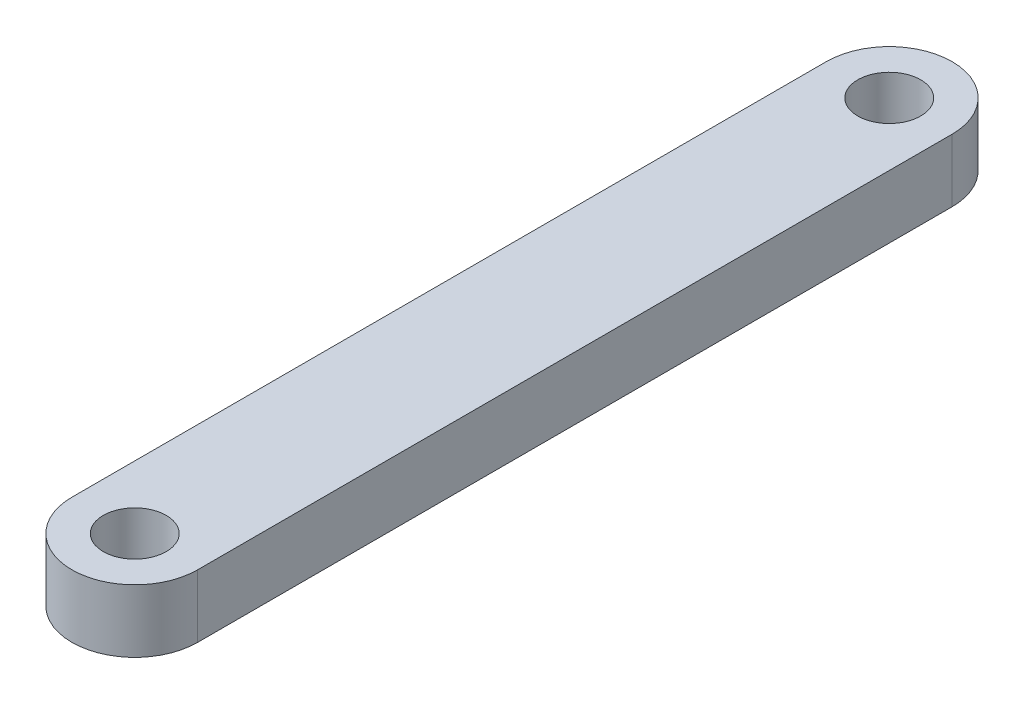
ISO-10303-21;
HEADER;
FILE_DESCRIPTION(('STEP AP214'),'2;1');
FILE_NAME('part.step','',(''),(''),'','','');
FILE_SCHEMA(('AUTOMOTIVE_DESIGN { 1 0 10303 214 1 1 1 1 }'));
ENDSEC;
DATA;
#1=APPLICATION_CONTEXT('core data for automotive mechanical design processes');
#2=APPLICATION_PROTOCOL_DEFINITION('international standard','automotive_design',2000,#1);
#3=PRODUCT_CONTEXT('',#1,'mechanical');
#4=PRODUCT('Part','Part','',(#3));
#5=PRODUCT_RELATED_PRODUCT_CATEGORY('part','',(#4));
#6=PRODUCT_DEFINITION_FORMATION('','',#4);
#7=PRODUCT_DEFINITION_CONTEXT('part definition',#1,'design');
#8=PRODUCT_DEFINITION('design','',#6,#7);
#9=PRODUCT_DEFINITION_SHAPE('','',#8);
#10=(LENGTH_UNIT() NAMED_UNIT(*) SI_UNIT(.MILLI.,.METRE.));
#11=(NAMED_UNIT(*) PLANE_ANGLE_UNIT() SI_UNIT($,.RADIAN.));
#12=(NAMED_UNIT(*) SI_UNIT($,.STERADIAN.) SOLID_ANGLE_UNIT());
#13=UNCERTAINTY_MEASURE_WITH_UNIT(LENGTH_MEASURE(1.E-05),#10,'distance_accuracy_value','');
#14=(GEOMETRIC_REPRESENTATION_CONTEXT(3) GLOBAL_UNCERTAINTY_ASSIGNED_CONTEXT((#13)) GLOBAL_UNIT_ASSIGNED_CONTEXT((#10,
#11,#12)) REPRESENTATION_CONTEXT('',''));
#15=CARTESIAN_POINT('',(0.,0.,0.));
#16=DIRECTION('',(0.,0.,1.));
#17=DIRECTION('',(1.,0.,0.));
#18=AXIS2_PLACEMENT_3D('',#15,#16,#17);
#19=CARTESIAN_POINT('',(0.,3.,36.));
#20=DIRECTION('',(0.,-1.,0.));
#21=DIRECTION('',(0.,0.,-1.));
#22=AXIS2_PLACEMENT_3D('',#19,#20,#21);
#23=PLANE('',#22);
#24=CARTESIAN_POINT('',(0.,3.,36.));
#25=DIRECTION('',(0.,1.,0.));
#26=DIRECTION('',(0.,0.,-1.));
#27=AXIS2_PLACEMENT_3D('',#24,#25,#26);
#28=CIRCLE('',#27,3.);
#29=CARTESIAN_POINT('',(-3.,3.,36.));
#30=VERTEX_POINT('',#29);
#31=CARTESIAN_POINT('',(3.,3.,36.));
#32=VERTEX_POINT('',#31);
#33=EDGE_CURVE('E85',#30,#32,#28,.T.);
#34=ORIENTED_EDGE('',*,*,#33,.T.);
#35=DIRECTION('',(0.,0.,-1.));
#36=VECTOR('',#35,1.);
#37=CARTESIAN_POINT('',(3.,3.,0.));
#38=LINE('',#37,#36);
#39=CARTESIAN_POINT('',(3.,3.,0.));
#40=VERTEX_POINT('',#39);
#41=EDGE_CURVE('E80',#32,#40,#38,.T.);
#42=ORIENTED_EDGE('',*,*,#41,.T.);
#43=CARTESIAN_POINT('',(0.,3.,0.));
#44=DIRECTION('',(0.,1.,0.));
#45=DIRECTION('',(0.,0.,1.));
#46=AXIS2_PLACEMENT_3D('',#43,#44,#45);
#47=CIRCLE('',#46,3.);
#48=CARTESIAN_POINT('',(-3.,3.,0.));
#49=VERTEX_POINT('',#48);
#50=EDGE_CURVE('E83',#40,#49,#47,.T.);
#51=ORIENTED_EDGE('',*,*,#50,.T.);
#52=DIRECTION('',(0.,0.,1.));
#53=VECTOR('',#52,1.);
#54=CARTESIAN_POINT('',(-3.,3.,0.));
#55=LINE('',#54,#53);
#56=EDGE_CURVE('E50',#49,#30,#55,.T.);
#57=ORIENTED_EDGE('',*,*,#56,.T.);
#58=EDGE_LOOP('',(#34,#42,#51,#57));
#59=FACE_BOUND('',#58,.T.);
#60=CARTESIAN_POINT('',(0.,3.,0.));
#61=DIRECTION('',(0.,1.,0.));
#62=DIRECTION('',(0.,0.,1.));
#63=AXIS2_PLACEMENT_3D('',#60,#61,#62);
#64=CIRCLE('',#63,1.5);
#65=CARTESIAN_POINT('',(0.,3.,1.5));
#66=VERTEX_POINT('',#65);
#67=EDGE_CURVE('E100',#66,#66,#64,.T.);
#68=ORIENTED_EDGE('',*,*,#67,.F.);
#69=EDGE_LOOP('',(#68));
#70=FACE_BOUND('',#69,.T.);
#71=CARTESIAN_POINT('',(0.,3.,36.));
#72=DIRECTION('',(0.,1.,0.));
#73=DIRECTION('',(0.,0.,-1.));
#74=AXIS2_PLACEMENT_3D('',#71,#72,#73);
#75=CIRCLE('',#74,1.5);
#76=CARTESIAN_POINT('',(0.,3.,34.5));
#77=VERTEX_POINT('',#76);
#78=EDGE_CURVE('E115',#77,#77,#75,.T.);
#79=ORIENTED_EDGE('',*,*,#78,.F.);
#80=EDGE_LOOP('',(#79));
#81=FACE_BOUND('',#80,.T.);
#82=ADVANCED_FACE('F33',(#59,#70,#81),#23,.F.);
#83=CARTESIAN_POINT('',(0.,0.,36.));
#84=DIRECTION('',(0.,-1.,0.));
#85=DIRECTION('',(0.,0.,-1.));
#86=AXIS2_PLACEMENT_3D('',#83,#84,#85);
#87=PLANE('',#86);
#88=CARTESIAN_POINT('',(0.,0.,0.));
#89=DIRECTION('',(0.,1.,0.));
#90=DIRECTION('',(0.,0.,1.));
#91=AXIS2_PLACEMENT_3D('',#88,#89,#90);
#92=CIRCLE('',#91,1.5);
#93=CARTESIAN_POINT('',(0.,0.,1.5));
#94=VERTEX_POINT('',#93);
#95=EDGE_CURVE('E112',#94,#94,#92,.T.);
#96=ORIENTED_EDGE('',*,*,#95,.T.);
#97=EDGE_LOOP('',(#96));
#98=FACE_BOUND('',#97,.T.);
#99=CARTESIAN_POINT('',(0.,0.,36.));
#100=DIRECTION('',(0.,1.,0.));
#101=DIRECTION('',(0.,0.,-1.));
#102=AXIS2_PLACEMENT_3D('',#99,#100,#101);
#103=CIRCLE('',#102,3.);
#104=CARTESIAN_POINT('',(-3.,0.,36.));
#105=VERTEX_POINT('',#104);
#106=CARTESIAN_POINT('',(3.,0.,36.));
#107=VERTEX_POINT('',#106);
#108=EDGE_CURVE('E97',#105,#107,#103,.T.);
#109=ORIENTED_EDGE('',*,*,#108,.F.);
#110=DIRECTION('',(0.,0.,1.));
#111=VECTOR('',#110,1.);
#112=CARTESIAN_POINT('',(-3.,0.,0.));
#113=LINE('',#112,#111);
#114=CARTESIAN_POINT('',(-3.,0.,0.));
#115=VERTEX_POINT('',#114);
#116=EDGE_CURVE('E73',#115,#105,#113,.T.);
#117=ORIENTED_EDGE('',*,*,#116,.F.);
#118=CARTESIAN_POINT('',(0.,0.,0.));
#119=DIRECTION('',(0.,1.,0.));
#120=DIRECTION('',(0.,0.,1.));
#121=AXIS2_PLACEMENT_3D('',#118,#119,#120);
#122=CIRCLE('',#121,3.);
#123=CARTESIAN_POINT('',(3.,0.,0.));
#124=VERTEX_POINT('',#123);
#125=EDGE_CURVE('E67',#124,#115,#122,.T.);
#126=ORIENTED_EDGE('',*,*,#125,.F.);
#127=DIRECTION('',(0.,0.,-1.));
#128=VECTOR('',#127,1.);
#129=CARTESIAN_POINT('',(3.,0.,0.));
#130=LINE('',#129,#128);
#131=EDGE_CURVE('E89',#107,#124,#130,.T.);
#132=ORIENTED_EDGE('',*,*,#131,.F.);
#133=EDGE_LOOP('',(#109,#117,#126,#132));
#134=FACE_BOUND('',#133,.T.);
#135=CARTESIAN_POINT('',(0.,0.,36.));
#136=DIRECTION('',(0.,1.,0.));
#137=DIRECTION('',(0.,0.,-1.));
#138=AXIS2_PLACEMENT_3D('',#135,#136,#137);
#139=CIRCLE('',#138,1.5);
#140=CARTESIAN_POINT('',(0.,0.,34.5));
#141=VERTEX_POINT('',#140);
#142=EDGE_CURVE('E118',#141,#141,#139,.T.);
#143=ORIENTED_EDGE('',*,*,#142,.T.);
#144=EDGE_LOOP('',(#143));
#145=FACE_BOUND('',#144,.T.);
#146=ADVANCED_FACE('F108',(#98,#134,#145),#87,.T.);
#147=CARTESIAN_POINT('',(0.,3.,36.));
#148=DIRECTION('',(0.,-1.,0.));
#149=DIRECTION('',(0.,0.,-1.));
#150=AXIS2_PLACEMENT_3D('',#147,#148,#149);
#151=CYLINDRICAL_SURFACE('',#150,3.);
#152=ORIENTED_EDGE('',*,*,#108,.T.);
#153=DIRECTION('',(0.,-1.,0.));
#154=VECTOR('',#153,1.);
#155=CARTESIAN_POINT('',(3.,3.,36.));
#156=LINE('',#155,#154);
#157=EDGE_CURVE('E11',#32,#107,#156,.T.);
#158=ORIENTED_EDGE('',*,*,#157,.F.);
#159=ORIENTED_EDGE('',*,*,#33,.F.);
#160=DIRECTION('',(0.,-1.,0.));
#161=VECTOR('',#160,1.);
#162=CARTESIAN_POINT('',(-3.,3.,36.));
#163=LINE('',#162,#161);
#164=EDGE_CURVE('E93',#30,#105,#163,.T.);
#165=ORIENTED_EDGE('',*,*,#164,.T.);
#166=EDGE_LOOP('',(#152,#158,#159,#165));
#167=FACE_BOUND('',#166,.T.);
#168=ADVANCED_FACE('F35',(#167),#151,.T.);
#169=CARTESIAN_POINT('',(3.,3.,0.));
#170=DIRECTION('',(-1.,0.,0.));
#171=DIRECTION('',(0.,0.,1.));
#172=AXIS2_PLACEMENT_3D('',#169,#170,#171);
#173=PLANE('',#172);
#174=ORIENTED_EDGE('',*,*,#131,.T.);
#175=DIRECTION('',(0.,-1.,0.));
#176=VECTOR('',#175,1.);
#177=CARTESIAN_POINT('',(3.,3.,0.));
#178=LINE('',#177,#176);
#179=EDGE_CURVE('E42',#40,#124,#178,.T.);
#180=ORIENTED_EDGE('',*,*,#179,.F.);
#181=ORIENTED_EDGE('',*,*,#41,.F.);
#182=ORIENTED_EDGE('',*,*,#157,.T.);
#183=EDGE_LOOP('',(#174,#180,#181,#182));
#184=FACE_BOUND('',#183,.T.);
#185=ADVANCED_FACE('F88',(#184),#173,.F.);
#186=CARTESIAN_POINT('',(0.,3.,0.));
#187=DIRECTION('',(0.,-1.,0.));
#188=DIRECTION('',(0.,0.,-1.));
#189=AXIS2_PLACEMENT_3D('',#186,#187,#188);
#190=CYLINDRICAL_SURFACE('',#189,3.);
#191=ORIENTED_EDGE('',*,*,#125,.T.);
#192=DIRECTION('',(0.,-1.,0.));
#193=VECTOR('',#192,1.);
#194=CARTESIAN_POINT('',(-3.,3.,0.));
#195=LINE('',#194,#193);
#196=EDGE_CURVE('E90',#49,#115,#195,.T.);
#197=ORIENTED_EDGE('',*,*,#196,.F.);
#198=ORIENTED_EDGE('',*,*,#50,.F.);
#199=ORIENTED_EDGE('',*,*,#179,.T.);
#200=EDGE_LOOP('',(#191,#197,#198,#199));
#201=FACE_BOUND('',#200,.T.);
#202=ADVANCED_FACE('F91',(#201),#190,.T.);
#203=CARTESIAN_POINT('',(-3.,3.,0.));
#204=DIRECTION('',(1.,0.,0.));
#205=DIRECTION('',(0.,0.,-1.));
#206=AXIS2_PLACEMENT_3D('',#203,#204,#205);
#207=PLANE('',#206);
#208=ORIENTED_EDGE('',*,*,#116,.T.);
#209=ORIENTED_EDGE('',*,*,#164,.F.);
#210=ORIENTED_EDGE('',*,*,#56,.F.);
#211=ORIENTED_EDGE('',*,*,#196,.T.);
#212=EDGE_LOOP('',(#208,#209,#210,#211));
#213=FACE_BOUND('',#212,.T.);
#214=ADVANCED_FACE('F105',(#213),#207,.F.);
#215=CARTESIAN_POINT('',(0.,3.,0.));
#216=DIRECTION('',(0.,-1.,0.));
#217=DIRECTION('',(0.,0.,-1.));
#218=AXIS2_PLACEMENT_3D('',#215,#216,#217);
#219=CYLINDRICAL_SURFACE('',#218,1.5);
#220=ORIENTED_EDGE('',*,*,#67,.T.);
#221=EDGE_LOOP('',(#220));
#222=FACE_BOUND('',#221,.T.);
#223=ORIENTED_EDGE('',*,*,#95,.F.);
#224=EDGE_LOOP('',(#223));
#225=FACE_BOUND('',#224,.T.);
#226=ADVANCED_FACE('F135',(#222,#225),#219,.F.);
#227=CARTESIAN_POINT('',(0.,3.,36.));
#228=DIRECTION('',(0.,-1.,0.));
#229=DIRECTION('',(0.,0.,-1.));
#230=AXIS2_PLACEMENT_3D('',#227,#228,#229);
#231=CYLINDRICAL_SURFACE('',#230,1.5);
#232=ORIENTED_EDGE('',*,*,#78,.T.);
#233=EDGE_LOOP('',(#232));
#234=FACE_BOUND('',#233,.T.);
#235=ORIENTED_EDGE('',*,*,#142,.F.);
#236=EDGE_LOOP('',(#235));
#237=FACE_BOUND('',#236,.T.);
#238=ADVANCED_FACE('F124',(#234,#237),#231,.F.);
#239=CLOSED_SHELL('',(#82,#146,#168,#185,#202,#214,#226,#238));
#240=MANIFOLD_SOLID_BREP('B2',#239);
#241=ADVANCED_BREP_SHAPE_REPRESENTATION('',(#18,#240),#14);
#242=SHAPE_DEFINITION_REPRESENTATION(#9,#241);
ENDSEC;
END-ISO-10303-21;
